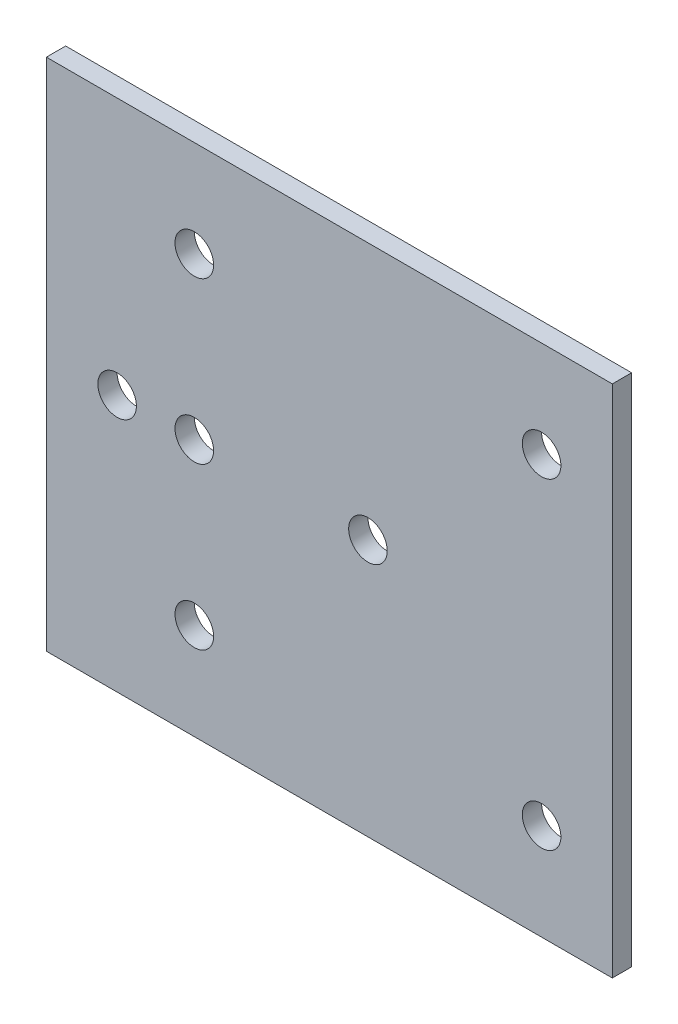
ISO-10303-21;
HEADER;
FILE_DESCRIPTION(('STEP AP214'),'2;1');
FILE_NAME('part.step','',(''),(''),'','','');
FILE_SCHEMA(('AUTOMOTIVE_DESIGN { 1 0 10303 214 1 1 1 1 }'));
ENDSEC;
DATA;
#1=APPLICATION_CONTEXT('core data for automotive mechanical design processes');
#2=APPLICATION_PROTOCOL_DEFINITION('international standard','automotive_design',2000,#1);
#3=PRODUCT_CONTEXT('',#1,'mechanical');
#4=PRODUCT('Part','Part','',(#3));
#5=PRODUCT_RELATED_PRODUCT_CATEGORY('part','',(#4));
#6=PRODUCT_DEFINITION_FORMATION('','',#4);
#7=PRODUCT_DEFINITION_CONTEXT('part definition',#1,'design');
#8=PRODUCT_DEFINITION('design','',#6,#7);
#9=PRODUCT_DEFINITION_SHAPE('','',#8);
#10=(LENGTH_UNIT() NAMED_UNIT(*) SI_UNIT(.MILLI.,.METRE.));
#11=(NAMED_UNIT(*) PLANE_ANGLE_UNIT() SI_UNIT($,.RADIAN.));
#12=(NAMED_UNIT(*) SI_UNIT($,.STERADIAN.) SOLID_ANGLE_UNIT());
#13=UNCERTAINTY_MEASURE_WITH_UNIT(LENGTH_MEASURE(1.E-05),#10,'distance_accuracy_value','');
#14=(GEOMETRIC_REPRESENTATION_CONTEXT(3) GLOBAL_UNCERTAINTY_ASSIGNED_CONTEXT((#13)) GLOBAL_UNIT_ASSIGNED_CONTEXT((#10,
#11,#12)) REPRESENTATION_CONTEXT('',''));
#15=CARTESIAN_POINT('',(0.,0.,0.));
#16=DIRECTION('',(0.,0.,1.));
#17=DIRECTION('',(1.,0.,0.));
#18=AXIS2_PLACEMENT_3D('',#15,#16,#17);
#19=CARTESIAN_POINT('',(0.,0.,3.));
#20=DIRECTION('',(0.,0.,-1.));
#21=DIRECTION('',(-1.,0.,0.));
#22=AXIS2_PLACEMENT_3D('',#19,#20,#21);
#23=PLANE('',#22);
#24=DIRECTION('',(-1.,0.,0.));
#25=VECTOR('',#24,1.);
#26=CARTESIAN_POINT('',(-50.,40.,3.));
#27=LINE('',#26,#25);
#28=CARTESIAN_POINT('',(38.,40.,3.));
#29=VERTEX_POINT('',#28);
#30=CARTESIAN_POINT('',(-50.,40.,3.));
#31=VERTEX_POINT('',#30);
#32=EDGE_CURVE('E87',#29,#31,#27,.T.);
#33=ORIENTED_EDGE('',*,*,#32,.T.);
#34=DIRECTION('',(0.,-1.,0.));
#35=VECTOR('',#34,1.);
#36=CARTESIAN_POINT('',(-50.,-40.,3.));
#37=LINE('',#36,#35);
#38=CARTESIAN_POINT('',(-50.,-40.,3.));
#39=VERTEX_POINT('',#38);
#40=EDGE_CURVE('E82',#31,#39,#37,.T.);
#41=ORIENTED_EDGE('',*,*,#40,.T.);
#42=DIRECTION('',(1.,0.,0.));
#43=VECTOR('',#42,1.);
#44=CARTESIAN_POINT('',(-50.,-40.,3.));
#45=LINE('',#44,#43);
#46=CARTESIAN_POINT('',(38.,-40.,3.));
#47=VERTEX_POINT('',#46);
#48=EDGE_CURVE('E85',#39,#47,#45,.T.);
#49=ORIENTED_EDGE('',*,*,#48,.T.);
#50=DIRECTION('',(0.,1.,0.));
#51=VECTOR('',#50,1.);
#52=CARTESIAN_POINT('',(38.,40.,3.));
#53=LINE('',#52,#51);
#54=EDGE_CURVE('E52',#47,#29,#53,.T.);
#55=ORIENTED_EDGE('',*,*,#54,.T.);
#56=EDGE_LOOP('',(#33,#41,#49,#55));
#57=FACE_BOUND('',#56,.T.);
#58=CARTESIAN_POINT('',(-27.,25.,3.));
#59=DIRECTION('',(0.,0.,1.));
#60=DIRECTION('',(1.,0.,0.));
#61=AXIS2_PLACEMENT_3D('',#58,#59,#60);
#62=CIRCLE('',#61,2.99999999999999);
#63=CARTESIAN_POINT('',(-24.,25.,3.));
#64=VERTEX_POINT('',#63);
#65=EDGE_CURVE('E102',#64,#64,#62,.T.);
#66=ORIENTED_EDGE('',*,*,#65,.F.);
#67=EDGE_LOOP('',(#66));
#68=FACE_BOUND('',#67,.T.);
#69=CARTESIAN_POINT('',(27.,25.,3.));
#70=DIRECTION('',(0.,0.,1.));
#71=DIRECTION('',(-1.,0.,0.));
#72=AXIS2_PLACEMENT_3D('',#69,#70,#71);
#73=CIRCLE('',#72,2.99999999999999);
#74=CARTESIAN_POINT('',(24.,25.,3.));
#75=VERTEX_POINT('',#74);
#76=EDGE_CURVE('E117',#75,#75,#73,.T.);
#77=ORIENTED_EDGE('',*,*,#76,.F.);
#78=EDGE_LOOP('',(#77));
#79=FACE_BOUND('',#78,.T.);
#80=CARTESIAN_POINT('',(27.,-25.,3.));
#81=DIRECTION('',(0.,0.,1.));
#82=DIRECTION('',(1.,0.,0.));
#83=AXIS2_PLACEMENT_3D('',#80,#81,#82);
#84=CIRCLE('',#83,2.99999999999999);
#85=CARTESIAN_POINT('',(30.,-25.,3.));
#86=VERTEX_POINT('',#85);
#87=EDGE_CURVE('E123',#86,#86,#84,.T.);
#88=ORIENTED_EDGE('',*,*,#87,.F.);
#89=EDGE_LOOP('',(#88));
#90=FACE_BOUND('',#89,.T.);
#91=CARTESIAN_POINT('',(-27.,-25.,3.));
#92=DIRECTION('',(0.,0.,1.));
#93=DIRECTION('',(-1.,0.,0.));
#94=AXIS2_PLACEMENT_3D('',#91,#92,#93);
#95=CIRCLE('',#94,2.99999999999999);
#96=CARTESIAN_POINT('',(-30.,-25.,3.));
#97=VERTEX_POINT('',#96);
#98=EDGE_CURVE('E129',#97,#97,#95,.T.);
#99=ORIENTED_EDGE('',*,*,#98,.F.);
#100=EDGE_LOOP('',(#99));
#101=FACE_BOUND('',#100,.T.);
#102=CARTESIAN_POINT('',(0.,0.,3.));
#103=DIRECTION('',(0.,0.,1.));
#104=DIRECTION('',(-1.,0.,0.));
#105=AXIS2_PLACEMENT_3D('',#102,#103,#104);
#106=CIRCLE('',#105,3.);
#107=CARTESIAN_POINT('',(-3.,0.,3.));
#108=VERTEX_POINT('',#107);
#109=EDGE_CURVE('E135',#108,#108,#106,.T.);
#110=ORIENTED_EDGE('',*,*,#109,.F.);
#111=EDGE_LOOP('',(#110));
#112=FACE_BOUND('',#111,.T.);
#113=CARTESIAN_POINT('',(-39.,0.,3.));
#114=DIRECTION('',(0.,0.,1.));
#115=DIRECTION('',(-1.,0.,0.));
#116=AXIS2_PLACEMENT_3D('',#113,#114,#115);
#117=CIRCLE('',#116,3.00000000000001);
#118=CARTESIAN_POINT('',(-42.,0.,3.));
#119=VERTEX_POINT('',#118);
#120=EDGE_CURVE('E141',#119,#119,#117,.T.);
#121=ORIENTED_EDGE('',*,*,#120,.F.);
#122=EDGE_LOOP('',(#121));
#123=FACE_BOUND('',#122,.T.);
#124=CARTESIAN_POINT('',(-27.,0.,3.));
#125=DIRECTION('',(0.,0.,1.));
#126=DIRECTION('',(-1.,0.,0.));
#127=AXIS2_PLACEMENT_3D('',#124,#125,#126);
#128=CIRCLE('',#127,3.);
#129=CARTESIAN_POINT('',(-30.,0.,3.));
#130=VERTEX_POINT('',#129);
#131=EDGE_CURVE('E147',#130,#130,#128,.T.);
#132=ORIENTED_EDGE('',*,*,#131,.F.);
#133=EDGE_LOOP('',(#132));
#134=FACE_BOUND('',#133,.T.);
#135=ADVANCED_FACE('F35',(#57,#68,#79,#90,#101,#112,#123,#134),#23,.F.);
#136=CARTESIAN_POINT('',(0.,0.,0.));
#137=DIRECTION('',(0.,0.,-1.));
#138=DIRECTION('',(-1.,0.,0.));
#139=AXIS2_PLACEMENT_3D('',#136,#137,#138);
#140=PLANE('',#139);
#141=CARTESIAN_POINT('',(-39.,0.,0.));
#142=DIRECTION('',(0.,0.,1.));
#143=DIRECTION('',(-1.,0.,0.));
#144=AXIS2_PLACEMENT_3D('',#141,#142,#143);
#145=CIRCLE('',#144,3.00000000000001);
#146=CARTESIAN_POINT('',(-42.,0.,0.));
#147=VERTEX_POINT('',#146);
#148=EDGE_CURVE('E144',#147,#147,#145,.T.);
#149=ORIENTED_EDGE('',*,*,#148,.T.);
#150=EDGE_LOOP('',(#149));
#151=FACE_BOUND('',#150,.T.);
#152=CARTESIAN_POINT('',(-27.,-25.,0.));
#153=DIRECTION('',(0.,0.,1.));
#154=DIRECTION('',(-1.,0.,0.));
#155=AXIS2_PLACEMENT_3D('',#152,#153,#154);
#156=CIRCLE('',#155,2.99999999999999);
#157=CARTESIAN_POINT('',(-30.,-25.,0.));
#158=VERTEX_POINT('',#157);
#159=EDGE_CURVE('E132',#158,#158,#156,.T.);
#160=ORIENTED_EDGE('',*,*,#159,.T.);
#161=EDGE_LOOP('',(#160));
#162=FACE_BOUND('',#161,.T.);
#163=CARTESIAN_POINT('',(27.,25.,0.));
#164=DIRECTION('',(0.,0.,1.));
#165=DIRECTION('',(-1.,0.,0.));
#166=AXIS2_PLACEMENT_3D('',#163,#164,#165);
#167=CIRCLE('',#166,2.99999999999999);
#168=CARTESIAN_POINT('',(24.,25.,0.));
#169=VERTEX_POINT('',#168);
#170=EDGE_CURVE('E120',#169,#169,#167,.T.);
#171=ORIENTED_EDGE('',*,*,#170,.T.);
#172=EDGE_LOOP('',(#171));
#173=FACE_BOUND('',#172,.T.);
#174=DIRECTION('',(-1.,0.,0.));
#175=VECTOR('',#174,1.);
#176=CARTESIAN_POINT('',(-50.,40.,0.));
#177=LINE('',#176,#175);
#178=CARTESIAN_POINT('',(38.,40.,0.));
#179=VERTEX_POINT('',#178);
#180=CARTESIAN_POINT('',(-50.,40.,0.));
#181=VERTEX_POINT('',#180);
#182=EDGE_CURVE('E99',#179,#181,#177,.T.);
#183=ORIENTED_EDGE('',*,*,#182,.F.);
#184=DIRECTION('',(0.,1.,0.));
#185=VECTOR('',#184,1.);
#186=CARTESIAN_POINT('',(38.,40.,0.));
#187=LINE('',#186,#185);
#188=CARTESIAN_POINT('',(38.,-40.,0.));
#189=VERTEX_POINT('',#188);
#190=EDGE_CURVE('E75',#189,#179,#187,.T.);
#191=ORIENTED_EDGE('',*,*,#190,.F.);
#192=DIRECTION('',(1.,0.,0.));
#193=VECTOR('',#192,1.);
#194=CARTESIAN_POINT('',(-50.,-40.,0.));
#195=LINE('',#194,#193);
#196=CARTESIAN_POINT('',(-50.,-40.,0.));
#197=VERTEX_POINT('',#196);
#198=EDGE_CURVE('E69',#197,#189,#195,.T.);
#199=ORIENTED_EDGE('',*,*,#198,.F.);
#200=DIRECTION('',(0.,-1.,0.));
#201=VECTOR('',#200,1.);
#202=CARTESIAN_POINT('',(-50.,-40.,0.));
#203=LINE('',#202,#201);
#204=EDGE_CURVE('E91',#181,#197,#203,.T.);
#205=ORIENTED_EDGE('',*,*,#204,.F.);
#206=EDGE_LOOP('',(#183,#191,#199,#205));
#207=FACE_BOUND('',#206,.T.);
#208=CARTESIAN_POINT('',(-27.,25.,0.));
#209=DIRECTION('',(0.,0.,1.));
#210=DIRECTION('',(1.,0.,0.));
#211=AXIS2_PLACEMENT_3D('',#208,#209,#210);
#212=CIRCLE('',#211,2.99999999999999);
#213=CARTESIAN_POINT('',(-24.,25.,0.));
#214=VERTEX_POINT('',#213);
#215=EDGE_CURVE('E114',#214,#214,#212,.T.);
#216=ORIENTED_EDGE('',*,*,#215,.T.);
#217=EDGE_LOOP('',(#216));
#218=FACE_BOUND('',#217,.T.);
#219=CARTESIAN_POINT('',(27.,-25.,0.));
#220=DIRECTION('',(0.,0.,1.));
#221=DIRECTION('',(1.,0.,0.));
#222=AXIS2_PLACEMENT_3D('',#219,#220,#221);
#223=CIRCLE('',#222,2.99999999999999);
#224=CARTESIAN_POINT('',(30.,-25.,0.));
#225=VERTEX_POINT('',#224);
#226=EDGE_CURVE('E126',#225,#225,#223,.T.);
#227=ORIENTED_EDGE('',*,*,#226,.T.);
#228=EDGE_LOOP('',(#227));
#229=FACE_BOUND('',#228,.T.);
#230=CARTESIAN_POINT('',(0.,0.,0.));
#231=DIRECTION('',(0.,0.,1.));
#232=DIRECTION('',(-1.,0.,0.));
#233=AXIS2_PLACEMENT_3D('',#230,#231,#232);
#234=CIRCLE('',#233,3.);
#235=CARTESIAN_POINT('',(-3.,0.,0.));
#236=VERTEX_POINT('',#235);
#237=EDGE_CURVE('E138',#236,#236,#234,.T.);
#238=ORIENTED_EDGE('',*,*,#237,.T.);
#239=EDGE_LOOP('',(#238));
#240=FACE_BOUND('',#239,.T.);
#241=CARTESIAN_POINT('',(-27.,0.,0.));
#242=DIRECTION('',(0.,0.,1.));
#243=DIRECTION('',(-1.,0.,0.));
#244=AXIS2_PLACEMENT_3D('',#241,#242,#243);
#245=CIRCLE('',#244,3.);
#246=CARTESIAN_POINT('',(-30.,0.,0.));
#247=VERTEX_POINT('',#246);
#248=EDGE_CURVE('E150',#247,#247,#245,.T.);
#249=ORIENTED_EDGE('',*,*,#248,.T.);
#250=EDGE_LOOP('',(#249));
#251=FACE_BOUND('',#250,.T.);
#252=ADVANCED_FACE('F110',(#151,#162,#173,#207,#218,#229,#240,#251),#140,.T.);
#253=CARTESIAN_POINT('',(-50.,40.,3.));
#254=DIRECTION('',(0.,-1.,0.));
#255=DIRECTION('',(1.,0.,0.));
#256=AXIS2_PLACEMENT_3D('',#253,#254,#255);
#257=PLANE('',#256);
#258=ORIENTED_EDGE('',*,*,#182,.T.);
#259=DIRECTION('',(0.,0.,-1.));
#260=VECTOR('',#259,1.);
#261=CARTESIAN_POINT('',(-50.,40.,3.));
#262=LINE('',#261,#260);
#263=EDGE_CURVE('E11',#31,#181,#262,.T.);
#264=ORIENTED_EDGE('',*,*,#263,.F.);
#265=ORIENTED_EDGE('',*,*,#32,.F.);
#266=DIRECTION('',(0.,0.,-1.));
#267=VECTOR('',#266,1.);
#268=CARTESIAN_POINT('',(38.,40.,3.));
#269=LINE('',#268,#267);
#270=EDGE_CURVE('E95',#29,#179,#269,.T.);
#271=ORIENTED_EDGE('',*,*,#270,.T.);
#272=EDGE_LOOP('',(#258,#264,#265,#271));
#273=FACE_BOUND('',#272,.T.);
#274=ADVANCED_FACE('F37',(#273),#257,.F.);
#275=CARTESIAN_POINT('',(-50.,-40.,3.));
#276=DIRECTION('',(1.,0.,0.));
#277=DIRECTION('',(0.,1.,0.));
#278=AXIS2_PLACEMENT_3D('',#275,#276,#277);
#279=PLANE('',#278);
#280=ORIENTED_EDGE('',*,*,#204,.T.);
#281=DIRECTION('',(0.,0.,-1.));
#282=VECTOR('',#281,1.);
#283=CARTESIAN_POINT('',(-50.,-40.,3.));
#284=LINE('',#283,#282);
#285=EDGE_CURVE('E44',#39,#197,#284,.T.);
#286=ORIENTED_EDGE('',*,*,#285,.F.);
#287=ORIENTED_EDGE('',*,*,#40,.F.);
#288=ORIENTED_EDGE('',*,*,#263,.T.);
#289=EDGE_LOOP('',(#280,#286,#287,#288));
#290=FACE_BOUND('',#289,.T.);
#291=ADVANCED_FACE('F90',(#290),#279,.F.);
#292=CARTESIAN_POINT('',(-50.,-40.,3.));
#293=DIRECTION('',(0.,1.,0.));
#294=DIRECTION('',(-1.,0.,0.));
#295=AXIS2_PLACEMENT_3D('',#292,#293,#294);
#296=PLANE('',#295);
#297=ORIENTED_EDGE('',*,*,#198,.T.);
#298=DIRECTION('',(0.,0.,-1.));
#299=VECTOR('',#298,1.);
#300=CARTESIAN_POINT('',(38.,-40.,3.));
#301=LINE('',#300,#299);
#302=EDGE_CURVE('E92',#47,#189,#301,.T.);
#303=ORIENTED_EDGE('',*,*,#302,.F.);
#304=ORIENTED_EDGE('',*,*,#48,.F.);
#305=ORIENTED_EDGE('',*,*,#285,.T.);
#306=EDGE_LOOP('',(#297,#303,#304,#305));
#307=FACE_BOUND('',#306,.T.);
#308=ADVANCED_FACE('F93',(#307),#296,.F.);
#309=CARTESIAN_POINT('',(38.,40.,3.));
#310=DIRECTION('',(-1.,0.,0.));
#311=DIRECTION('',(0.,0.,1.));
#312=AXIS2_PLACEMENT_3D('',#309,#310,#311);
#313=PLANE('',#312);
#314=ORIENTED_EDGE('',*,*,#190,.T.);
#315=ORIENTED_EDGE('',*,*,#270,.F.);
#316=ORIENTED_EDGE('',*,*,#54,.F.);
#317=ORIENTED_EDGE('',*,*,#302,.T.);
#318=EDGE_LOOP('',(#314,#315,#316,#317));
#319=FACE_BOUND('',#318,.T.);
#320=ADVANCED_FACE('F107',(#319),#313,.F.);
#321=CARTESIAN_POINT('',(-27.,25.,3.));
#322=DIRECTION('',(0.,0.,-1.));
#323=DIRECTION('',(-1.,0.,0.));
#324=AXIS2_PLACEMENT_3D('',#321,#322,#323);
#325=CYLINDRICAL_SURFACE('',#324,2.99999999999999);
#326=ORIENTED_EDGE('',*,*,#65,.T.);
#327=EDGE_LOOP('',(#326));
#328=FACE_BOUND('',#327,.T.);
#329=ORIENTED_EDGE('',*,*,#215,.F.);
#330=EDGE_LOOP('',(#329));
#331=FACE_BOUND('',#330,.T.);
#332=ADVANCED_FACE('F167',(#328,#331),#325,.F.);
#333=CARTESIAN_POINT('',(27.,25.,3.));
#334=DIRECTION('',(0.,0.,-1.));
#335=DIRECTION('',(-1.,0.,0.));
#336=AXIS2_PLACEMENT_3D('',#333,#334,#335);
#337=CYLINDRICAL_SURFACE('',#336,2.99999999999999);
#338=ORIENTED_EDGE('',*,*,#76,.T.);
#339=EDGE_LOOP('',(#338));
#340=FACE_BOUND('',#339,.T.);
#341=ORIENTED_EDGE('',*,*,#170,.F.);
#342=EDGE_LOOP('',(#341));
#343=FACE_BOUND('',#342,.T.);
#344=ADVANCED_FACE('F213',(#340,#343),#337,.F.);
#345=CARTESIAN_POINT('',(27.,-25.,3.));
#346=DIRECTION('',(0.,0.,-1.));
#347=DIRECTION('',(-1.,0.,0.));
#348=AXIS2_PLACEMENT_3D('',#345,#346,#347);
#349=CYLINDRICAL_SURFACE('',#348,2.99999999999999);
#350=ORIENTED_EDGE('',*,*,#87,.T.);
#351=EDGE_LOOP('',(#350));
#352=FACE_BOUND('',#351,.T.);
#353=ORIENTED_EDGE('',*,*,#226,.F.);
#354=EDGE_LOOP('',(#353));
#355=FACE_BOUND('',#354,.T.);
#356=ADVANCED_FACE('F221',(#352,#355),#349,.F.);
#357=CARTESIAN_POINT('',(-27.,-25.,3.));
#358=DIRECTION('',(0.,0.,-1.));
#359=DIRECTION('',(-1.,0.,0.));
#360=AXIS2_PLACEMENT_3D('',#357,#358,#359);
#361=CYLINDRICAL_SURFACE('',#360,2.99999999999999);
#362=ORIENTED_EDGE('',*,*,#98,.T.);
#363=EDGE_LOOP('',(#362));
#364=FACE_BOUND('',#363,.T.);
#365=ORIENTED_EDGE('',*,*,#159,.F.);
#366=EDGE_LOOP('',(#365));
#367=FACE_BOUND('',#366,.T.);
#368=ADVANCED_FACE('F229',(#364,#367),#361,.F.);
#369=CARTESIAN_POINT('',(0.,0.,3.));
#370=DIRECTION('',(0.,0.,-1.));
#371=DIRECTION('',(-1.,0.,0.));
#372=AXIS2_PLACEMENT_3D('',#369,#370,#371);
#373=CYLINDRICAL_SURFACE('',#372,3.);
#374=ORIENTED_EDGE('',*,*,#109,.T.);
#375=EDGE_LOOP('',(#374));
#376=FACE_BOUND('',#375,.T.);
#377=ORIENTED_EDGE('',*,*,#237,.F.);
#378=EDGE_LOOP('',(#377));
#379=FACE_BOUND('',#378,.T.);
#380=ADVANCED_FACE('F238',(#376,#379),#373,.F.);
#381=CARTESIAN_POINT('',(-39.,0.,3.));
#382=DIRECTION('',(0.,0.,-1.));
#383=DIRECTION('',(-1.,0.,0.));
#384=AXIS2_PLACEMENT_3D('',#381,#382,#383);
#385=CYLINDRICAL_SURFACE('',#384,3.00000000000001);
#386=ORIENTED_EDGE('',*,*,#120,.T.);
#387=EDGE_LOOP('',(#386));
#388=FACE_BOUND('',#387,.T.);
#389=ORIENTED_EDGE('',*,*,#148,.F.);
#390=EDGE_LOOP('',(#389));
#391=FACE_BOUND('',#390,.T.);
#392=ADVANCED_FACE('F247',(#388,#391),#385,.F.);
#393=CARTESIAN_POINT('',(-27.,0.,3.));
#394=DIRECTION('',(0.,0.,-1.));
#395=DIRECTION('',(-1.,0.,0.));
#396=AXIS2_PLACEMENT_3D('',#393,#394,#395);
#397=CYLINDRICAL_SURFACE('',#396,3.);
#398=ORIENTED_EDGE('',*,*,#131,.T.);
#399=EDGE_LOOP('',(#398));
#400=FACE_BOUND('',#399,.T.);
#401=ORIENTED_EDGE('',*,*,#248,.F.);
#402=EDGE_LOOP('',(#401));
#403=FACE_BOUND('',#402,.T.);
#404=ADVANCED_FACE('F156',(#400,#403),#397,.F.);
#405=CLOSED_SHELL('',(#135,#252,#274,#291,#308,#320,#332,#344,#356,#368,#380,#392,#404));
#406=MANIFOLD_SOLID_BREP('B2',#405);
#407=ADVANCED_BREP_SHAPE_REPRESENTATION('',(#18,#406),#14);
#408=SHAPE_DEFINITION_REPRESENTATION(#9,#407);
ENDSEC;
END-ISO-10303-21;
